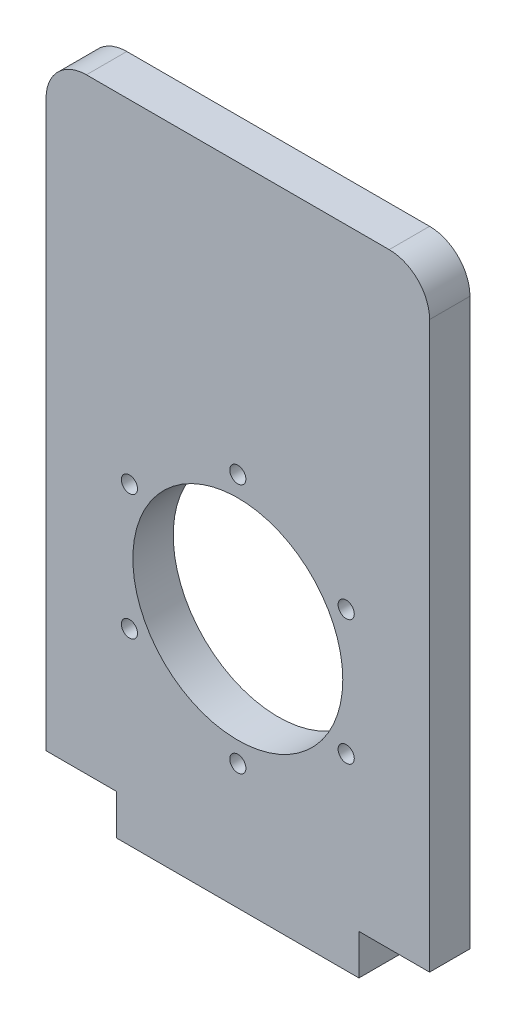
ISO-10303-21;
HEADER;
FILE_DESCRIPTION(('STEP AP214'),'2;1');
FILE_NAME('part.step','',(''),(''),'','','');
FILE_SCHEMA(('AUTOMOTIVE_DESIGN { 1 0 10303 214 1 1 1 1 }'));
ENDSEC;
DATA;
#1=APPLICATION_CONTEXT('core data for automotive mechanical design processes');
#2=APPLICATION_PROTOCOL_DEFINITION('international standard','automotive_design',2000,#1);
#3=PRODUCT_CONTEXT('',#1,'mechanical');
#4=PRODUCT('Part','Part','',(#3));
#5=PRODUCT_RELATED_PRODUCT_CATEGORY('part','',(#4));
#6=PRODUCT_DEFINITION_FORMATION('','',#4);
#7=PRODUCT_DEFINITION_CONTEXT('part definition',#1,'design');
#8=PRODUCT_DEFINITION('design','',#6,#7);
#9=PRODUCT_DEFINITION_SHAPE('','',#8);
#10=(LENGTH_UNIT() NAMED_UNIT(*) SI_UNIT(.MILLI.,.METRE.));
#11=(NAMED_UNIT(*) PLANE_ANGLE_UNIT() SI_UNIT($,.RADIAN.));
#12=(NAMED_UNIT(*) SI_UNIT($,.STERADIAN.) SOLID_ANGLE_UNIT());
#13=UNCERTAINTY_MEASURE_WITH_UNIT(LENGTH_MEASURE(1.E-05),#10,'distance_accuracy_value','');
#14=(GEOMETRIC_REPRESENTATION_CONTEXT(3) GLOBAL_UNCERTAINTY_ASSIGNED_CONTEXT((#13)) GLOBAL_UNIT_ASSIGNED_CONTEXT((#10,
#11,#12)) REPRESENTATION_CONTEXT('',''));
#15=CARTESIAN_POINT('',(0.,0.,0.));
#16=DIRECTION('',(0.,0.,1.));
#17=DIRECTION('',(1.,0.,0.));
#18=AXIS2_PLACEMENT_3D('',#15,#16,#17);
#19=CARTESIAN_POINT('',(47.5,0.,10.));
#20=DIRECTION('',(1.,0.,0.));
#21=DIRECTION('',(0.,1.,0.));
#22=AXIS2_PLACEMENT_3D('',#19,#20,#21);
#23=PLANE('',#22);
#24=DIRECTION('',(0.,-1.,0.));
#25=VECTOR('',#24,1.);
#26=CARTESIAN_POINT('',(47.5,0.,0.));
#27=LINE('',#26,#25);
#28=CARTESIAN_POINT('',(47.5,88.,0.));
#29=VERTEX_POINT('',#28);
#30=CARTESIAN_POINT('',(47.5,-52.,0.));
#31=VERTEX_POINT('',#30);
#32=EDGE_CURVE('E186',#29,#31,#27,.T.);
#33=ORIENTED_EDGE('',*,*,#32,.F.);
#34=DIRECTION('',(0.,0.,-1.));
#35=VECTOR('',#34,1.);
#36=CARTESIAN_POINT('',(47.5,88.,10.));
#37=LINE('',#36,#35);
#38=CARTESIAN_POINT('',(47.5,88.,10.));
#39=VERTEX_POINT('',#38);
#40=EDGE_CURVE('E65',#29,#39,#37,.F.);
#41=ORIENTED_EDGE('',*,*,#40,.T.);
#42=DIRECTION('',(0.,-1.,0.));
#43=VECTOR('',#42,1.);
#44=CARTESIAN_POINT('',(47.5,0.,10.));
#45=LINE('',#44,#43);
#46=CARTESIAN_POINT('',(47.5,-52.,10.));
#47=VERTEX_POINT('',#46);
#48=EDGE_CURVE('E172',#39,#47,#45,.T.);
#49=ORIENTED_EDGE('',*,*,#48,.T.);
#50=DIRECTION('',(0.,0.,-1.));
#51=VECTOR('',#50,1.);
#52=CARTESIAN_POINT('',(47.5,-52.,10.));
#53=LINE('',#52,#51);
#54=EDGE_CURVE('E190',#47,#31,#53,.T.);
#55=ORIENTED_EDGE('',*,*,#54,.T.);
#56=EDGE_LOOP('',(#33,#41,#49,#55));
#57=FACE_BOUND('',#56,.T.);
#58=ADVANCED_FACE('F41',(#57),#23,.T.);
#59=CARTESIAN_POINT('',(0.,98.,10.));
#60=DIRECTION('',(0.,1.,0.));
#61=DIRECTION('',(-1.,0.,0.));
#62=AXIS2_PLACEMENT_3D('',#59,#60,#61);
#63=PLANE('',#62);
#64=DIRECTION('',(1.,0.,0.));
#65=VECTOR('',#64,1.);
#66=CARTESIAN_POINT('',(0.,98.,10.));
#67=LINE('',#66,#65);
#68=CARTESIAN_POINT('',(-37.5,98.,10.));
#69=VERTEX_POINT('',#68);
#70=CARTESIAN_POINT('',(37.5,98.,10.));
#71=VERTEX_POINT('',#70);
#72=EDGE_CURVE('E128',#69,#71,#67,.T.);
#73=ORIENTED_EDGE('',*,*,#72,.T.);
#74=DIRECTION('',(0.,0.,-1.));
#75=VECTOR('',#74,1.);
#76=CARTESIAN_POINT('',(37.5,98.,10.));
#77=LINE('',#76,#75);
#78=CARTESIAN_POINT('',(37.5,98.,0.));
#79=VERTEX_POINT('',#78);
#80=EDGE_CURVE('E150',#71,#79,#77,.T.);
#81=ORIENTED_EDGE('',*,*,#80,.T.);
#82=DIRECTION('',(1.,0.,0.));
#83=VECTOR('',#82,1.);
#84=CARTESIAN_POINT('',(0.,98.,0.));
#85=LINE('',#84,#83);
#86=CARTESIAN_POINT('',(-37.5,98.,0.));
#87=VERTEX_POINT('',#86);
#88=EDGE_CURVE('E188',#87,#79,#85,.T.);
#89=ORIENTED_EDGE('',*,*,#88,.F.);
#90=DIRECTION('',(0.,0.,-1.));
#91=VECTOR('',#90,1.);
#92=CARTESIAN_POINT('',(-37.5,98.,10.));
#93=LINE('',#92,#91);
#94=EDGE_CURVE('E146',#87,#69,#93,.F.);
#95=ORIENTED_EDGE('',*,*,#94,.T.);
#96=EDGE_LOOP('',(#73,#81,#89,#95));
#97=FACE_BOUND('',#96,.T.);
#98=ADVANCED_FACE('F176',(#97),#63,.T.);
#99=CARTESIAN_POINT('',(-47.5,0.,10.));
#100=DIRECTION('',(1.,0.,0.));
#101=DIRECTION('',(0.,1.,0.));
#102=AXIS2_PLACEMENT_3D('',#99,#100,#101);
#103=PLANE('',#102);
#104=DIRECTION('',(0.,-1.,0.));
#105=VECTOR('',#104,1.);
#106=CARTESIAN_POINT('',(-47.5,0.,10.));
#107=LINE('',#106,#105);
#108=CARTESIAN_POINT('',(-47.5,88.,10.));
#109=VERTEX_POINT('',#108);
#110=CARTESIAN_POINT('',(-47.5,-52.,10.));
#111=VERTEX_POINT('',#110);
#112=EDGE_CURVE('E119',#109,#111,#107,.T.);
#113=ORIENTED_EDGE('',*,*,#112,.F.);
#114=DIRECTION('',(0.,0.,-1.));
#115=VECTOR('',#114,1.);
#116=CARTESIAN_POINT('',(-47.5,88.,0.));
#117=LINE('',#116,#115);
#118=CARTESIAN_POINT('',(-47.5,88.,0.));
#119=VERTEX_POINT('',#118);
#120=EDGE_CURVE('E11',#109,#119,#117,.T.);
#121=ORIENTED_EDGE('',*,*,#120,.T.);
#122=DIRECTION('',(0.,-1.,0.));
#123=VECTOR('',#122,1.);
#124=CARTESIAN_POINT('',(-47.5,0.,0.));
#125=LINE('',#124,#123);
#126=CARTESIAN_POINT('',(-47.5,-52.,0.));
#127=VERTEX_POINT('',#126);
#128=EDGE_CURVE('E143',#119,#127,#125,.T.);
#129=ORIENTED_EDGE('',*,*,#128,.T.);
#130=DIRECTION('',(0.,0.,-1.));
#131=VECTOR('',#130,1.);
#132=CARTESIAN_POINT('',(-47.5,-52.,10.));
#133=LINE('',#132,#131);
#134=EDGE_CURVE('E134',#111,#127,#133,.T.);
#135=ORIENTED_EDGE('',*,*,#134,.F.);
#136=EDGE_LOOP('',(#113,#121,#129,#135));
#137=FACE_BOUND('',#136,.T.);
#138=ADVANCED_FACE('F141',(#137),#103,.F.);
#139=CARTESIAN_POINT('',(0.,-52.,10.));
#140=DIRECTION('',(0.,1.,0.));
#141=DIRECTION('',(-1.,0.,0.));
#142=AXIS2_PLACEMENT_3D('',#139,#140,#141);
#143=PLANE('',#142);
#144=DIRECTION('',(1.,0.,0.));
#145=VECTOR('',#144,1.);
#146=CARTESIAN_POINT('',(0.,-52.,0.));
#147=LINE('',#146,#145);
#148=CARTESIAN_POINT('',(-30.,-52.,0.));
#149=VERTEX_POINT('',#148);
#150=EDGE_CURVE('E205',#127,#149,#147,.T.);
#151=ORIENTED_EDGE('',*,*,#150,.T.);
#152=DIRECTION('',(0.,0.,-1.));
#153=VECTOR('',#152,1.);
#154=CARTESIAN_POINT('',(-30.,-52.,10.));
#155=LINE('',#154,#153);
#156=CARTESIAN_POINT('',(-30.,-52.,10.));
#157=VERTEX_POINT('',#156);
#158=EDGE_CURVE('E136',#157,#149,#155,.T.);
#159=ORIENTED_EDGE('',*,*,#158,.F.);
#160=DIRECTION('',(1.,0.,0.));
#161=VECTOR('',#160,1.);
#162=CARTESIAN_POINT('',(0.,-52.,10.));
#163=LINE('',#162,#161);
#164=EDGE_CURVE('E122',#111,#157,#163,.T.);
#165=ORIENTED_EDGE('',*,*,#164,.F.);
#166=ORIENTED_EDGE('',*,*,#134,.T.);
#167=EDGE_LOOP('',(#151,#159,#165,#166));
#168=FACE_BOUND('',#167,.T.);
#169=ADVANCED_FACE('F133',(#168),#143,.F.);
#170=CARTESIAN_POINT('',(-30.,0.,10.));
#171=DIRECTION('',(1.,0.,0.));
#172=DIRECTION('',(0.,0.,-1.));
#173=AXIS2_PLACEMENT_3D('',#170,#171,#172);
#174=PLANE('',#173);
#175=DIRECTION('',(0.,-1.,0.));
#176=VECTOR('',#175,1.);
#177=CARTESIAN_POINT('',(-30.,0.,0.));
#178=LINE('',#177,#176);
#179=CARTESIAN_POINT('',(-30.,-62.,0.));
#180=VERTEX_POINT('',#179);
#181=EDGE_CURVE('E208',#149,#180,#178,.T.);
#182=ORIENTED_EDGE('',*,*,#181,.T.);
#183=DIRECTION('',(0.,0.,-1.));
#184=VECTOR('',#183,1.);
#185=CARTESIAN_POINT('',(-30.,-62.,10.));
#186=LINE('',#185,#184);
#187=CARTESIAN_POINT('',(-30.,-62.,10.));
#188=VERTEX_POINT('',#187);
#189=EDGE_CURVE('E152',#188,#180,#186,.T.);
#190=ORIENTED_EDGE('',*,*,#189,.F.);
#191=DIRECTION('',(0.,-1.,0.));
#192=VECTOR('',#191,1.);
#193=CARTESIAN_POINT('',(-30.,0.,10.));
#194=LINE('',#193,#192);
#195=EDGE_CURVE('E138',#157,#188,#194,.T.);
#196=ORIENTED_EDGE('',*,*,#195,.F.);
#197=ORIENTED_EDGE('',*,*,#158,.T.);
#198=EDGE_LOOP('',(#182,#190,#196,#197));
#199=FACE_BOUND('',#198,.T.);
#200=ADVANCED_FACE('F237',(#199),#174,.F.);
#201=CARTESIAN_POINT('',(0.,-62.,10.));
#202=DIRECTION('',(0.,-1.,0.));
#203=DIRECTION('',(1.,0.,0.));
#204=AXIS2_PLACEMENT_3D('',#201,#202,#203);
#205=PLANE('',#204);
#206=DIRECTION('',(-1.,0.,0.));
#207=VECTOR('',#206,1.);
#208=CARTESIAN_POINT('',(0.,-62.,0.));
#209=LINE('',#208,#207);
#210=CARTESIAN_POINT('',(30.,-62.,0.));
#211=VERTEX_POINT('',#210);
#212=EDGE_CURVE('E213',#211,#180,#209,.T.);
#213=ORIENTED_EDGE('',*,*,#212,.F.);
#214=DIRECTION('',(0.,0.,-1.));
#215=VECTOR('',#214,1.);
#216=CARTESIAN_POINT('',(30.,-62.,10.));
#217=LINE('',#216,#215);
#218=CARTESIAN_POINT('',(30.,-62.,10.));
#219=VERTEX_POINT('',#218);
#220=EDGE_CURVE('E226',#219,#211,#217,.T.);
#221=ORIENTED_EDGE('',*,*,#220,.F.);
#222=DIRECTION('',(-1.,0.,0.));
#223=VECTOR('',#222,1.);
#224=CARTESIAN_POINT('',(0.,-62.,10.));
#225=LINE('',#224,#223);
#226=EDGE_CURVE('E235',#219,#188,#225,.T.);
#227=ORIENTED_EDGE('',*,*,#226,.T.);
#228=ORIENTED_EDGE('',*,*,#189,.T.);
#229=EDGE_LOOP('',(#213,#221,#227,#228));
#230=FACE_BOUND('',#229,.T.);
#231=ADVANCED_FACE('F233',(#230),#205,.T.);
#232=CARTESIAN_POINT('',(29.9999999999999,0.,10.));
#233=DIRECTION('',(1.,0.,0.));
#234=DIRECTION('',(0.,1.,0.));
#235=AXIS2_PLACEMENT_3D('',#232,#233,#234);
#236=PLANE('',#235);
#237=DIRECTION('',(0.,-1.,0.));
#238=VECTOR('',#237,1.);
#239=CARTESIAN_POINT('',(29.9999999999999,0.,0.));
#240=LINE('',#239,#238);
#241=CARTESIAN_POINT('',(30.,-52.,0.));
#242=VERTEX_POINT('',#241);
#243=EDGE_CURVE('E217',#242,#211,#240,.T.);
#244=ORIENTED_EDGE('',*,*,#243,.F.);
#245=DIRECTION('',(0.,0.,-1.));
#246=VECTOR('',#245,1.);
#247=CARTESIAN_POINT('',(30.,-52.,10.));
#248=LINE('',#247,#246);
#249=CARTESIAN_POINT('',(30.,-52.,10.));
#250=VERTEX_POINT('',#249);
#251=EDGE_CURVE('E223',#250,#242,#248,.T.);
#252=ORIENTED_EDGE('',*,*,#251,.F.);
#253=DIRECTION('',(0.,-1.,0.));
#254=VECTOR('',#253,1.);
#255=CARTESIAN_POINT('',(29.9999999999999,0.,10.));
#256=LINE('',#255,#254);
#257=EDGE_CURVE('E244',#250,#219,#256,.T.);
#258=ORIENTED_EDGE('',*,*,#257,.T.);
#259=ORIENTED_EDGE('',*,*,#220,.T.);
#260=EDGE_LOOP('',(#244,#252,#258,#259));
#261=FACE_BOUND('',#260,.T.);
#262=ADVANCED_FACE('F240',(#261),#236,.T.);
#263=CARTESIAN_POINT('',(0.,0.,10.));
#264=DIRECTION('',(0.,0.,-1.));
#265=DIRECTION('',(-1.,0.,0.));
#266=AXIS2_PLACEMENT_3D('',#263,#264,#265);
#267=CYLINDRICAL_SURFACE('',#266,26.);
#268=CARTESIAN_POINT('',(0.,0.,10.));
#269=DIRECTION('',(0.,0.,1.));
#270=DIRECTION('',(1.,0.,0.));
#271=AXIS2_PLACEMENT_3D('',#268,#269,#270);
#272=CIRCLE('',#271,26.);
#273=CARTESIAN_POINT('',(26.,0.,10.));
#274=VERTEX_POINT('',#273);
#275=EDGE_CURVE('E345',#274,#274,#272,.T.);
#276=ORIENTED_EDGE('',*,*,#275,.T.);
#277=EDGE_LOOP('',(#276));
#278=FACE_BOUND('',#277,.T.);
#279=CARTESIAN_POINT('',(0.,0.,0.));
#280=DIRECTION('',(0.,0.,1.));
#281=DIRECTION('',(1.,0.,0.));
#282=AXIS2_PLACEMENT_3D('',#279,#280,#281);
#283=CIRCLE('',#282,26.);
#284=CARTESIAN_POINT('',(26.,0.,0.));
#285=VERTEX_POINT('',#284);
#286=EDGE_CURVE('E193',#285,#285,#283,.T.);
#287=ORIENTED_EDGE('',*,*,#286,.F.);
#288=EDGE_LOOP('',(#287));
#289=FACE_BOUND('',#288,.T.);
#290=ADVANCED_FACE('F280',(#278,#289),#267,.F.);
#291=CARTESIAN_POINT('',(0.,31.,10.));
#292=DIRECTION('',(0.,0.,-1.));
#293=DIRECTION('',(-1.,0.,0.));
#294=AXIS2_PLACEMENT_3D('',#291,#292,#293);
#295=CYLINDRICAL_SURFACE('',#294,2.);
#296=CARTESIAN_POINT('',(0.,31.,10.));
#297=DIRECTION('',(0.,0.,1.));
#298=DIRECTION('',(1.,0.,0.));
#299=AXIS2_PLACEMENT_3D('',#296,#297,#298);
#300=CIRCLE('',#299,2.);
#301=CARTESIAN_POINT('',(2.,31.,10.));
#302=VERTEX_POINT('',#301);
#303=EDGE_CURVE('E342',#302,#302,#300,.T.);
#304=ORIENTED_EDGE('',*,*,#303,.T.);
#305=EDGE_LOOP('',(#304));
#306=FACE_BOUND('',#305,.T.);
#307=CARTESIAN_POINT('',(0.,31.,0.));
#308=DIRECTION('',(0.,0.,1.));
#309=DIRECTION('',(1.,0.,0.));
#310=AXIS2_PLACEMENT_3D('',#307,#308,#309);
#311=CIRCLE('',#310,2.);
#312=CARTESIAN_POINT('',(2.,31.,0.));
#313=VERTEX_POINT('',#312);
#314=EDGE_CURVE('E199',#313,#313,#311,.T.);
#315=ORIENTED_EDGE('',*,*,#314,.F.);
#316=EDGE_LOOP('',(#315));
#317=FACE_BOUND('',#316,.T.);
#318=ADVANCED_FACE('F277',(#306,#317),#295,.F.);
#319=CARTESIAN_POINT('',(26.8467875173179,15.5000000000059,10.));
#320=DIRECTION('',(0.,0.,-1.));
#321=DIRECTION('',(-1.,0.,0.));
#322=AXIS2_PLACEMENT_3D('',#319,#320,#321);
#323=CYLINDRICAL_SURFACE('',#322,2.);
#324=CARTESIAN_POINT('',(26.8467875173179,15.5000000000059,10.));
#325=DIRECTION('',(0.,0.,1.));
#326=DIRECTION('',(1.,0.,0.));
#327=AXIS2_PLACEMENT_3D('',#324,#325,#326);
#328=CIRCLE('',#327,2.);
#329=CARTESIAN_POINT('',(28.8467875173179,15.5000000000059,10.));
#330=VERTEX_POINT('',#329);
#331=EDGE_CURVE('E339',#330,#330,#328,.T.);
#332=ORIENTED_EDGE('',*,*,#331,.T.);
#333=EDGE_LOOP('',(#332));
#334=FACE_BOUND('',#333,.T.);
#335=CARTESIAN_POINT('',(26.8467875173179,15.5000000000059,0.));
#336=DIRECTION('',(0.,0.,1.));
#337=DIRECTION('',(1.,0.,0.));
#338=AXIS2_PLACEMENT_3D('',#335,#336,#337);
#339=CIRCLE('',#338,2.);
#340=CARTESIAN_POINT('',(28.8467875173179,15.5000000000059,0.));
#341=VERTEX_POINT('',#340);
#342=EDGE_CURVE('E268',#341,#341,#339,.T.);
#343=ORIENTED_EDGE('',*,*,#342,.F.);
#344=EDGE_LOOP('',(#343));
#345=FACE_BOUND('',#344,.T.);
#346=ADVANCED_FACE('F279',(#334,#345),#323,.F.);
#347=CARTESIAN_POINT('',(26.8467875173232,-15.4999999999914,10.));
#348=DIRECTION('',(0.,0.,-1.));
#349=DIRECTION('',(-1.,0.,0.));
#350=AXIS2_PLACEMENT_3D('',#347,#348,#349);
#351=CYLINDRICAL_SURFACE('',#350,2.00000000000001);
#352=CARTESIAN_POINT('',(26.8467875173232,-15.4999999999914,10.));
#353=DIRECTION('',(0.,0.,1.));
#354=DIRECTION('',(1.,0.,0.));
#355=AXIS2_PLACEMENT_3D('',#352,#353,#354);
#356=CIRCLE('',#355,2.00000000000001);
#357=CARTESIAN_POINT('',(28.8467875173232,-15.4999999999914,10.));
#358=VERTEX_POINT('',#357);
#359=EDGE_CURVE('E335',#358,#358,#356,.T.);
#360=ORIENTED_EDGE('',*,*,#359,.T.);
#361=EDGE_LOOP('',(#360));
#362=FACE_BOUND('',#361,.T.);
#363=CARTESIAN_POINT('',(26.8467875173232,-15.4999999999914,0.));
#364=DIRECTION('',(0.,0.,1.));
#365=DIRECTION('',(1.,0.,0.));
#366=AXIS2_PLACEMENT_3D('',#363,#364,#365);
#367=CIRCLE('',#366,2.00000000000001);
#368=CARTESIAN_POINT('',(28.8467875173232,-15.4999999999914,0.));
#369=VERTEX_POINT('',#368);
#370=EDGE_CURVE('E264',#369,#369,#367,.T.);
#371=ORIENTED_EDGE('',*,*,#370,.F.);
#372=EDGE_LOOP('',(#371));
#373=FACE_BOUND('',#372,.T.);
#374=ADVANCED_FACE('F287',(#362,#373),#351,.F.);
#375=CARTESIAN_POINT('',(1.06026840952789E-11,-30.9999999999947,10.));
#376=DIRECTION('',(0.,0.,-1.));
#377=DIRECTION('',(-1.,0.,0.));
#378=AXIS2_PLACEMENT_3D('',#375,#376,#377);
#379=CYLINDRICAL_SURFACE('',#378,2.);
#380=CARTESIAN_POINT('',(1.06026840952789E-11,-30.9999999999947,10.));
#381=DIRECTION('',(0.,0.,1.));
#382=DIRECTION('',(1.,0.,0.));
#383=AXIS2_PLACEMENT_3D('',#380,#381,#382);
#384=CIRCLE('',#383,2.);
#385=CARTESIAN_POINT('',(2.0000000000106,-30.9999999999947,10.));
#386=VERTEX_POINT('',#385);
#387=EDGE_CURVE('E331',#386,#386,#384,.T.);
#388=ORIENTED_EDGE('',*,*,#387,.T.);
#389=EDGE_LOOP('',(#388));
#390=FACE_BOUND('',#389,.T.);
#391=CARTESIAN_POINT('',(1.06026840952789E-11,-30.9999999999947,0.));
#392=DIRECTION('',(0.,0.,1.));
#393=DIRECTION('',(1.,0.,0.));
#394=AXIS2_PLACEMENT_3D('',#391,#392,#393);
#395=CIRCLE('',#394,2.);
#396=CARTESIAN_POINT('',(2.0000000000106,-30.9999999999947,0.));
#397=VERTEX_POINT('',#396);
#398=EDGE_CURVE('E260',#397,#397,#395,.T.);
#399=ORIENTED_EDGE('',*,*,#398,.F.);
#400=EDGE_LOOP('',(#399));
#401=FACE_BOUND('',#400,.T.);
#402=ADVANCED_FACE('F381',(#390,#401),#379,.F.);
#403=CARTESIAN_POINT('',(-26.8467875173073,-15.5000000000006,10.));
#404=DIRECTION('',(0.,0.,-1.));
#405=DIRECTION('',(-1.,0.,0.));
#406=AXIS2_PLACEMENT_3D('',#403,#404,#405);
#407=CYLINDRICAL_SURFACE('',#406,2.);
#408=CARTESIAN_POINT('',(-26.8467875173073,-15.5000000000006,10.));
#409=DIRECTION('',(0.,0.,1.));
#410=DIRECTION('',(1.,0.,0.));
#411=AXIS2_PLACEMENT_3D('',#408,#409,#410);
#412=CIRCLE('',#411,2.);
#413=CARTESIAN_POINT('',(-24.8467875173073,-15.5000000000006,10.));
#414=VERTEX_POINT('',#413);
#415=EDGE_CURVE('E327',#414,#414,#412,.T.);
#416=ORIENTED_EDGE('',*,*,#415,.T.);
#417=EDGE_LOOP('',(#416));
#418=FACE_BOUND('',#417,.T.);
#419=CARTESIAN_POINT('',(-26.8467875173073,-15.5000000000006,0.));
#420=DIRECTION('',(0.,0.,1.));
#421=DIRECTION('',(1.,0.,0.));
#422=AXIS2_PLACEMENT_3D('',#419,#420,#421);
#423=CIRCLE('',#422,2.);
#424=CARTESIAN_POINT('',(-24.8467875173073,-15.5000000000006,0.));
#425=VERTEX_POINT('',#424);
#426=EDGE_CURVE('E256',#425,#425,#423,.T.);
#427=ORIENTED_EDGE('',*,*,#426,.F.);
#428=EDGE_LOOP('',(#427));
#429=FACE_BOUND('',#428,.T.);
#430=ADVANCED_FACE('F367',(#418,#429),#407,.F.);
#431=CARTESIAN_POINT('',(-26.8467875173126,15.4999999999967,10.));
#432=DIRECTION('',(0.,0.,-1.));
#433=DIRECTION('',(-1.,0.,0.));
#434=AXIS2_PLACEMENT_3D('',#431,#432,#433);
#435=CYLINDRICAL_SURFACE('',#434,2.);
#436=CARTESIAN_POINT('',(-26.8467875173126,15.4999999999967,10.));
#437=DIRECTION('',(0.,0.,1.));
#438=DIRECTION('',(1.,0.,0.));
#439=AXIS2_PLACEMENT_3D('',#436,#437,#438);
#440=CIRCLE('',#439,2.);
#441=CARTESIAN_POINT('',(-24.8467875173126,15.4999999999967,10.));
#442=VERTEX_POINT('',#441);
#443=EDGE_CURVE('E323',#442,#442,#440,.T.);
#444=ORIENTED_EDGE('',*,*,#443,.T.);
#445=EDGE_LOOP('',(#444));
#446=FACE_BOUND('',#445,.T.);
#447=CARTESIAN_POINT('',(-26.8467875173126,15.4999999999967,0.));
#448=DIRECTION('',(0.,0.,1.));
#449=DIRECTION('',(1.,0.,0.));
#450=AXIS2_PLACEMENT_3D('',#447,#448,#449);
#451=CIRCLE('',#450,2.);
#452=CARTESIAN_POINT('',(-24.8467875173126,15.4999999999967,0.));
#453=VERTEX_POINT('',#452);
#454=EDGE_CURVE('E252',#453,#453,#451,.T.);
#455=ORIENTED_EDGE('',*,*,#454,.F.);
#456=EDGE_LOOP('',(#455));
#457=FACE_BOUND('',#456,.T.);
#458=ADVANCED_FACE('F311',(#446,#457),#435,.F.);
#459=EDGE_CURVE('E209',#242,#31,#147,.T.);
#460=ORIENTED_EDGE('',*,*,#459,.T.);
#461=ORIENTED_EDGE('',*,*,#54,.F.);
#462=EDGE_CURVE('E140',#250,#47,#163,.T.);
#463=ORIENTED_EDGE('',*,*,#462,.F.);
#464=ORIENTED_EDGE('',*,*,#251,.T.);
#465=EDGE_LOOP('',(#460,#461,#463,#464));
#466=FACE_BOUND('',#465,.T.);
#467=ADVANCED_FACE('F308',(#466),#143,.F.);
#468=CARTESIAN_POINT('',(0.,0.,10.));
#469=DIRECTION('',(0.,0.,1.));
#470=DIRECTION('',(1.,0.,0.));
#471=AXIS2_PLACEMENT_3D('',#468,#469,#470);
#472=PLANE('',#471);
#473=ORIENTED_EDGE('',*,*,#443,.F.);
#474=EDGE_LOOP('',(#473));
#475=FACE_BOUND('',#474,.T.);
#476=ORIENTED_EDGE('',*,*,#415,.F.);
#477=EDGE_LOOP('',(#476));
#478=FACE_BOUND('',#477,.T.);
#479=ORIENTED_EDGE('',*,*,#387,.F.);
#480=EDGE_LOOP('',(#479));
#481=FACE_BOUND('',#480,.T.);
#482=ORIENTED_EDGE('',*,*,#359,.F.);
#483=EDGE_LOOP('',(#482));
#484=FACE_BOUND('',#483,.T.);
#485=ORIENTED_EDGE('',*,*,#331,.F.);
#486=EDGE_LOOP('',(#485));
#487=FACE_BOUND('',#486,.T.);
#488=ORIENTED_EDGE('',*,*,#303,.F.);
#489=EDGE_LOOP('',(#488));
#490=FACE_BOUND('',#489,.T.);
#491=ORIENTED_EDGE('',*,*,#275,.F.);
#492=EDGE_LOOP('',(#491));
#493=FACE_BOUND('',#492,.T.);
#494=ORIENTED_EDGE('',*,*,#48,.F.);
#495=CARTESIAN_POINT('',(37.5,88.,10.));
#496=DIRECTION('',(0.,0.,1.));
#497=DIRECTION('',(1.,0.,0.));
#498=AXIS2_PLACEMENT_3D('',#495,#496,#497);
#499=CIRCLE('',#498,10.);
#500=EDGE_CURVE('E50',#39,#71,#499,.T.);
#501=ORIENTED_EDGE('',*,*,#500,.T.);
#502=ORIENTED_EDGE('',*,*,#72,.F.);
#503=CARTESIAN_POINT('',(-37.5,88.,10.));
#504=DIRECTION('',(0.,0.,1.));
#505=DIRECTION('',(1.,0.,0.));
#506=AXIS2_PLACEMENT_3D('',#503,#504,#505);
#507=CIRCLE('',#506,10.);
#508=EDGE_CURVE('E57',#69,#109,#507,.T.);
#509=ORIENTED_EDGE('',*,*,#508,.T.);
#510=ORIENTED_EDGE('',*,*,#112,.T.);
#511=ORIENTED_EDGE('',*,*,#164,.T.);
#512=ORIENTED_EDGE('',*,*,#195,.T.);
#513=ORIENTED_EDGE('',*,*,#226,.F.);
#514=ORIENTED_EDGE('',*,*,#257,.F.);
#515=ORIENTED_EDGE('',*,*,#462,.T.);
#516=EDGE_LOOP('',(#494,#501,#502,#509,#510,#511,#512,#513,#514,#515));
#517=FACE_BOUND('',#516,.T.);
#518=ADVANCED_FACE('F121',(#475,#478,#481,#484,#487,#490,#493,#517),#472,.T.);
#519=CARTESIAN_POINT('',(0.,0.,0.));
#520=DIRECTION('',(0.,0.,1.));
#521=DIRECTION('',(1.,0.,0.));
#522=AXIS2_PLACEMENT_3D('',#519,#520,#521);
#523=PLANE('',#522);
#524=ORIENTED_EDGE('',*,*,#454,.T.);
#525=EDGE_LOOP('',(#524));
#526=FACE_BOUND('',#525,.T.);
#527=ORIENTED_EDGE('',*,*,#426,.T.);
#528=EDGE_LOOP('',(#527));
#529=FACE_BOUND('',#528,.T.);
#530=ORIENTED_EDGE('',*,*,#398,.T.);
#531=EDGE_LOOP('',(#530));
#532=FACE_BOUND('',#531,.T.);
#533=ORIENTED_EDGE('',*,*,#370,.T.);
#534=EDGE_LOOP('',(#533));
#535=FACE_BOUND('',#534,.T.);
#536=ORIENTED_EDGE('',*,*,#342,.T.);
#537=EDGE_LOOP('',(#536));
#538=FACE_BOUND('',#537,.T.);
#539=ORIENTED_EDGE('',*,*,#314,.T.);
#540=EDGE_LOOP('',(#539));
#541=FACE_BOUND('',#540,.T.);
#542=ORIENTED_EDGE('',*,*,#286,.T.);
#543=EDGE_LOOP('',(#542));
#544=FACE_BOUND('',#543,.T.);
#545=ORIENTED_EDGE('',*,*,#88,.T.);
#546=CARTESIAN_POINT('',(37.5,88.,0.));
#547=DIRECTION('',(0.,0.,1.));
#548=DIRECTION('',(1.,0.,0.));
#549=AXIS2_PLACEMENT_3D('',#546,#547,#548);
#550=CIRCLE('',#549,10.);
#551=EDGE_CURVE('E162',#79,#29,#550,.F.);
#552=ORIENTED_EDGE('',*,*,#551,.T.);
#553=ORIENTED_EDGE('',*,*,#32,.T.);
#554=ORIENTED_EDGE('',*,*,#459,.F.);
#555=ORIENTED_EDGE('',*,*,#243,.T.);
#556=ORIENTED_EDGE('',*,*,#212,.T.);
#557=ORIENTED_EDGE('',*,*,#181,.F.);
#558=ORIENTED_EDGE('',*,*,#150,.F.);
#559=ORIENTED_EDGE('',*,*,#128,.F.);
#560=CARTESIAN_POINT('',(-37.5,88.,0.));
#561=DIRECTION('',(0.,0.,1.));
#562=DIRECTION('',(1.,0.,0.));
#563=AXIS2_PLACEMENT_3D('',#560,#561,#562);
#564=CIRCLE('',#563,10.);
#565=EDGE_CURVE('E159',#119,#87,#564,.F.);
#566=ORIENTED_EDGE('',*,*,#565,.T.);
#567=EDGE_LOOP('',(#545,#552,#553,#554,#555,#556,#557,#558,#559,#566));
#568=FACE_BOUND('',#567,.T.);
#569=ADVANCED_FACE('F184',(#526,#529,#532,#535,#538,#541,#544,#568),#523,.F.);
#570=CARTESIAN_POINT('',(37.5,88.,10.));
#571=DIRECTION('',(0.,0.,-1.));
#572=DIRECTION('',(-1.,0.,0.));
#573=AXIS2_PLACEMENT_3D('',#570,#571,#572);
#574=CYLINDRICAL_SURFACE('',#573,10.);
#575=ORIENTED_EDGE('',*,*,#500,.F.);
#576=ORIENTED_EDGE('',*,*,#40,.F.);
#577=ORIENTED_EDGE('',*,*,#551,.F.);
#578=ORIENTED_EDGE('',*,*,#80,.F.);
#579=EDGE_LOOP('',(#575,#576,#577,#578));
#580=FACE_BOUND('',#579,.T.);
#581=ADVANCED_FACE('F182',(#580),#574,.T.);
#582=CARTESIAN_POINT('',(-37.5,88.,10.));
#583=DIRECTION('',(0.,0.,1.));
#584=DIRECTION('',(1.,0.,0.));
#585=AXIS2_PLACEMENT_3D('',#582,#583,#584);
#586=CYLINDRICAL_SURFACE('',#585,10.);
#587=ORIENTED_EDGE('',*,*,#508,.F.);
#588=ORIENTED_EDGE('',*,*,#94,.F.);
#589=ORIENTED_EDGE('',*,*,#565,.F.);
#590=ORIENTED_EDGE('',*,*,#120,.F.);
#591=EDGE_LOOP('',(#587,#588,#589,#590));
#592=FACE_BOUND('',#591,.T.);
#593=ADVANCED_FACE('F43',(#592),#586,.T.);
#594=CLOSED_SHELL('',(#58,#98,#138,#169,#200,#231,#262,#290,#318,#346,#374,#402,#430,#458,#467,
#518,#569,#581,#593));
#595=MANIFOLD_SOLID_BREP('B2',#594);
#596=ADVANCED_BREP_SHAPE_REPRESENTATION('',(#18,#595),#14);
#597=SHAPE_DEFINITION_REPRESENTATION(#9,#596);
ENDSEC;
END-ISO-10303-21;
